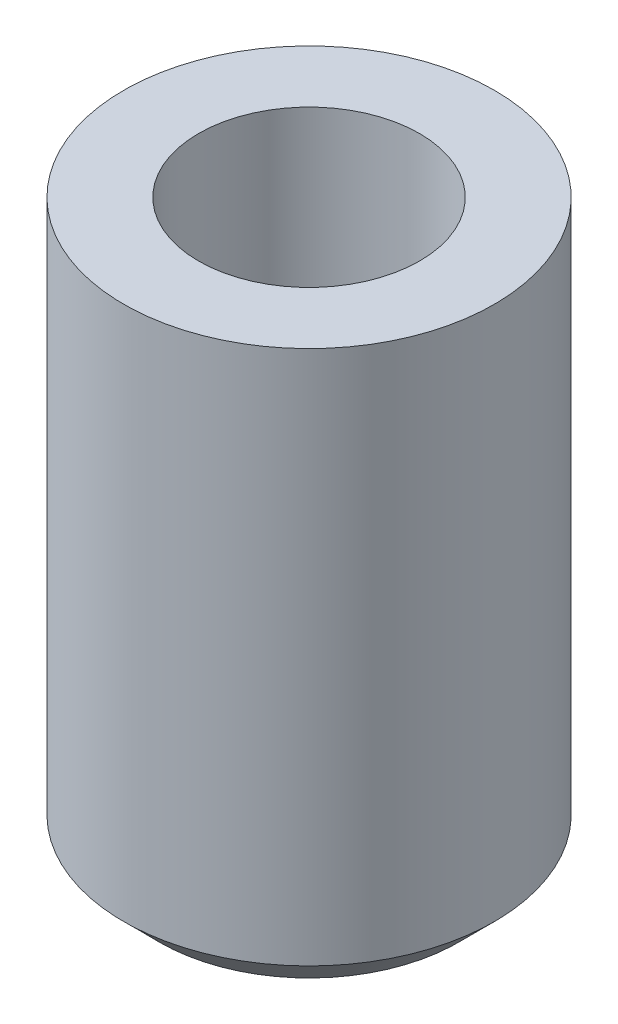
ISO-10303-21;
HEADER;
FILE_DESCRIPTION(('STEP AP214'),'2;1');
FILE_NAME('part.step','',(''),(''),'','','');
FILE_SCHEMA(('AUTOMOTIVE_DESIGN { 1 0 10303 214 1 1 1 1 }'));
ENDSEC;
DATA;
#1=APPLICATION_CONTEXT('core data for automotive mechanical design processes');
#2=APPLICATION_PROTOCOL_DEFINITION('international standard','automotive_design',2000,#1);
#3=PRODUCT_CONTEXT('',#1,'mechanical');
#4=PRODUCT('Part','Part','',(#3));
#5=PRODUCT_RELATED_PRODUCT_CATEGORY('part','',(#4));
#6=PRODUCT_DEFINITION_FORMATION('','',#4);
#7=PRODUCT_DEFINITION_CONTEXT('part definition',#1,'design');
#8=PRODUCT_DEFINITION('design','',#6,#7);
#9=PRODUCT_DEFINITION_SHAPE('','',#8);
#10=(LENGTH_UNIT() NAMED_UNIT(*) SI_UNIT(.MILLI.,.METRE.));
#11=(NAMED_UNIT(*) PLANE_ANGLE_UNIT() SI_UNIT($,.RADIAN.));
#12=(NAMED_UNIT(*) SI_UNIT($,.STERADIAN.) SOLID_ANGLE_UNIT());
#13=UNCERTAINTY_MEASURE_WITH_UNIT(LENGTH_MEASURE(1.E-05),#10,'distance_accuracy_value','');
#14=(GEOMETRIC_REPRESENTATION_CONTEXT(3) GLOBAL_UNCERTAINTY_ASSIGNED_CONTEXT((#13)) GLOBAL_UNIT_ASSIGNED_CONTEXT((#10,
#11,#12)) REPRESENTATION_CONTEXT('',''));
#15=CARTESIAN_POINT('',(0.,0.,0.));
#16=DIRECTION('',(0.,0.,1.));
#17=DIRECTION('',(1.,0.,0.));
#18=AXIS2_PLACEMENT_3D('',#15,#16,#17);
#19=CARTESIAN_POINT('',(0.,0.,0.));
#20=DIRECTION('',(0.,-1.,0.));
#21=DIRECTION('',(0.,0.,-1.));
#22=AXIS2_PLACEMENT_3D('',#19,#20,#21);
#23=PLANE('',#22);
#24=CARTESIAN_POINT('',(0.,0.,0.));
#25=DIRECTION('',(0.,-1.,0.));
#26=DIRECTION('',(0.,0.,-1.));
#27=AXIS2_PLACEMENT_3D('',#24,#25,#26);
#28=CIRCLE('',#27,2.1);
#29=CARTESIAN_POINT('',(0.,0.,-2.1));
#30=VERTEX_POINT('',#29);
#31=EDGE_CURVE('E50',#30,#30,#28,.T.);
#32=ORIENTED_EDGE('',*,*,#31,.T.);
#33=EDGE_LOOP('',(#32));
#34=FACE_BOUND('',#33,.T.);
#35=ADVANCED_FACE('F41',(#34),#23,.T.);
#36=CARTESIAN_POINT('',(0.,0.,0.));
#37=DIRECTION('',(0.,-1.,0.));
#38=DIRECTION('',(0.,0.,-1.));
#39=AXIS2_PLACEMENT_3D('',#36,#37,#38);
#40=CYLINDRICAL_SURFACE('',#39,2.6);
#41=CARTESIAN_POINT('',(0.,0.500000000000001,0.));
#42=DIRECTION('',(0.,-1.,0.));
#43=DIRECTION('',(0.,0.,-1.));
#44=AXIS2_PLACEMENT_3D('',#41,#42,#43);
#45=CIRCLE('',#44,2.6);
#46=CARTESIAN_POINT('',(0.,0.500000000000001,-2.6));
#47=VERTEX_POINT('',#46);
#48=EDGE_CURVE('E10',#47,#47,#45,.F.);
#49=ORIENTED_EDGE('',*,*,#48,.T.);
#50=EDGE_LOOP('',(#49));
#51=FACE_BOUND('',#50,.T.);
#52=CARTESIAN_POINT('',(0.,8.,0.));
#53=DIRECTION('',(0.,-1.,0.));
#54=DIRECTION('',(0.,0.,-1.));
#55=AXIS2_PLACEMENT_3D('',#52,#53,#54);
#56=CIRCLE('',#55,2.6);
#57=CARTESIAN_POINT('',(0.,8.,-2.6));
#58=VERTEX_POINT('',#57);
#59=EDGE_CURVE('E55',#58,#58,#56,.T.);
#60=ORIENTED_EDGE('',*,*,#59,.T.);
#61=EDGE_LOOP('',(#60));
#62=FACE_BOUND('',#61,.T.);
#63=ADVANCED_FACE('F85',(#51,#62),#40,.T.);
#64=CARTESIAN_POINT('',(0.,8.,-2.6));
#65=DIRECTION('',(0.,1.,0.));
#66=DIRECTION('',(0.,0.,1.));
#67=AXIS2_PLACEMENT_3D('',#64,#65,#66);
#68=PLANE('',#67);
#69=CARTESIAN_POINT('',(0.,8.,0.));
#70=DIRECTION('',(0.,-1.,0.));
#71=DIRECTION('',(0.,0.,-1.));
#72=AXIS2_PLACEMENT_3D('',#69,#70,#71);
#73=CIRCLE('',#72,1.55);
#74=CARTESIAN_POINT('',(0.,8.,-1.55));
#75=VERTEX_POINT('',#74);
#76=EDGE_CURVE('E60',#75,#75,#73,.T.);
#77=ORIENTED_EDGE('',*,*,#76,.T.);
#78=EDGE_LOOP('',(#77));
#79=FACE_BOUND('',#78,.T.);
#80=ORIENTED_EDGE('',*,*,#59,.F.);
#81=EDGE_LOOP('',(#80));
#82=FACE_BOUND('',#81,.T.);
#83=ADVANCED_FACE('F82',(#79,#82),#68,.T.);
#84=CARTESIAN_POINT('',(0.,0.,0.));
#85=DIRECTION('',(0.,-1.,0.));
#86=DIRECTION('',(0.,0.,-1.));
#87=AXIS2_PLACEMENT_3D('',#84,#85,#86);
#88=CYLINDRICAL_SURFACE('',#87,1.55);
#89=CARTESIAN_POINT('',(0.,2.,0.));
#90=DIRECTION('',(0.,-1.,0.));
#91=DIRECTION('',(0.,0.,-1.));
#92=AXIS2_PLACEMENT_3D('',#89,#90,#91);
#93=CIRCLE('',#92,1.55);
#94=CARTESIAN_POINT('',(0.,2.,-1.55));
#95=VERTEX_POINT('',#94);
#96=EDGE_CURVE('E66',#95,#95,#93,.T.);
#97=ORIENTED_EDGE('',*,*,#96,.T.);
#98=EDGE_LOOP('',(#97));
#99=FACE_BOUND('',#98,.T.);
#100=ORIENTED_EDGE('',*,*,#76,.F.);
#101=EDGE_LOOP('',(#100));
#102=FACE_BOUND('',#101,.T.);
#103=ADVANCED_FACE('F71',(#99,#102),#88,.F.);
#104=CARTESIAN_POINT('',(0.,2.,-1.55));
#105=DIRECTION('',(0.,1.,0.));
#106=DIRECTION('',(0.,0.,1.));
#107=AXIS2_PLACEMENT_3D('',#104,#105,#106);
#108=PLANE('',#107);
#109=ORIENTED_EDGE('',*,*,#96,.F.);
#110=EDGE_LOOP('',(#109));
#111=FACE_BOUND('',#110,.T.);
#112=ADVANCED_FACE('F74',(#111),#108,.T.);
#113=CARTESIAN_POINT('',(0.,0.,0.));
#114=DIRECTION('',(0.,1.,0.));
#115=DIRECTION('',(0.,0.,1.));
#116=AXIS2_PLACEMENT_3D('',#113,#114,#115);
#117=CONICAL_SURFACE('',#116,2.1,0.785398163397446);
#118=ORIENTED_EDGE('',*,*,#48,.F.);
#119=EDGE_LOOP('',(#118));
#120=FACE_BOUND('',#119,.T.);
#121=ORIENTED_EDGE('',*,*,#31,.F.);
#122=EDGE_LOOP('',(#121));
#123=FACE_BOUND('',#122,.T.);
#124=ADVANCED_FACE('F44',(#120,#123),#117,.T.);
#125=CLOSED_SHELL('',(#35,#63,#83,#103,#112,#124));
#126=MANIFOLD_SOLID_BREP('B2',#125);
#127=ADVANCED_BREP_SHAPE_REPRESENTATION('',(#18,#126),#14);
#128=SHAPE_DEFINITION_REPRESENTATION(#9,#127);
ENDSEC;
END-ISO-10303-21;
